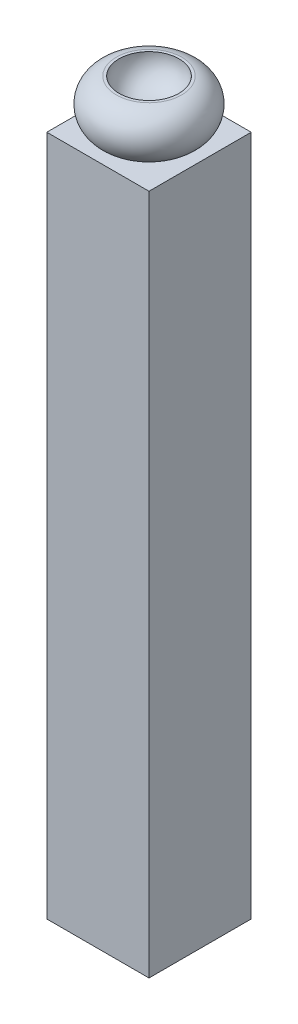
ISO-10303-21;
HEADER;
FILE_DESCRIPTION(('STEP AP214'),'2;1');
FILE_NAME('part.step','',(''),(''),'','','');
FILE_SCHEMA(('AUTOMOTIVE_DESIGN { 1 0 10303 214 1 1 1 1 }'));
ENDSEC;
DATA;
#1=APPLICATION_CONTEXT('core data for automotive mechanical design processes');
#2=APPLICATION_PROTOCOL_DEFINITION('international standard','automotive_design',2000,#1);
#3=PRODUCT_CONTEXT('',#1,'mechanical');
#4=PRODUCT('Part','Part','',(#3));
#5=PRODUCT_RELATED_PRODUCT_CATEGORY('part','',(#4));
#6=PRODUCT_DEFINITION_FORMATION('','',#4);
#7=PRODUCT_DEFINITION_CONTEXT('part definition',#1,'design');
#8=PRODUCT_DEFINITION('design','',#6,#7);
#9=PRODUCT_DEFINITION_SHAPE('','',#8);
#10=(LENGTH_UNIT() NAMED_UNIT(*) SI_UNIT(.MILLI.,.METRE.));
#11=(NAMED_UNIT(*) PLANE_ANGLE_UNIT() SI_UNIT($,.RADIAN.));
#12=(NAMED_UNIT(*) SI_UNIT($,.STERADIAN.) SOLID_ANGLE_UNIT());
#13=UNCERTAINTY_MEASURE_WITH_UNIT(LENGTH_MEASURE(1.E-05),#10,'distance_accuracy_value','');
#14=(GEOMETRIC_REPRESENTATION_CONTEXT(3) GLOBAL_UNCERTAINTY_ASSIGNED_CONTEXT((#13)) GLOBAL_UNIT_ASSIGNED_CONTEXT((#10,
#11,#12)) REPRESENTATION_CONTEXT('',''));
#15=CARTESIAN_POINT('',(0.,0.,0.));
#16=DIRECTION('',(0.,0.,1.));
#17=DIRECTION('',(1.,0.,0.));
#18=AXIS2_PLACEMENT_3D('',#15,#16,#17);
#19=CARTESIAN_POINT('',(0.,8.19273891154382,0.));
#20=DIRECTION('',(0.,-1.,0.));
#21=DIRECTION('',(0.,0.,-1.));
#22=AXIS2_PLACEMENT_3D('',#19,#20,#21);
#23=TOROIDAL_SURFACE('',#22,5.3293309185256,4.572);
#24=CARTESIAN_POINT('',(0.,12.7,0.));
#25=DIRECTION('',(0.,-1.,0.));
#26=DIRECTION('',(0.,0.,-1.));
#27=AXIS2_PLACEMENT_3D('',#24,#25,#26);
#28=CIRCLE('',#27,6.096);
#29=CARTESIAN_POINT('',(0.,12.7,-6.096));
#30=VERTEX_POINT('',#29);
#31=EDGE_CURVE('E125',#30,#30,#28,.T.);
#32=ORIENTED_EDGE('',*,*,#31,.T.);
#33=EDGE_LOOP('',(#32));
#34=FACE_BOUND('',#33,.T.);
#35=CARTESIAN_POINT('',(0.,3.63673505649357,0.));
#36=DIRECTION('',(0.,-1.,0.));
#37=DIRECTION('',(0.,0.,-1.));
#38=AXIS2_PLACEMENT_3D('',#35,#36,#37);
#39=CIRCLE('',#38,5.71144722643093);
#40=CARTESIAN_POINT('',(0.,3.63673505649357,-5.71144722643093));
#41=VERTEX_POINT('',#40);
#42=EDGE_CURVE('E11',#41,#41,#39,.T.);
#43=ORIENTED_EDGE('',*,*,#42,.F.);
#44=EDGE_LOOP('',(#43));
#45=FACE_BOUND('',#44,.T.);
#46=ADVANCED_FACE('F41',(#34,#45),#23,.T.);
#47=CARTESIAN_POINT('',(0.,12.7,0.));
#48=DIRECTION('',(0.,-1.,0.));
#49=DIRECTION('',(0.,0.,-1.));
#50=AXIS2_PLACEMENT_3D('',#47,#48,#49);
#51=PLANE('',#50);
#52=ORIENTED_EDGE('',*,*,#31,.F.);
#53=EDGE_LOOP('',(#52));
#54=FACE_BOUND('',#53,.T.);
#55=CARTESIAN_POINT('',(0.,12.7,0.));
#56=DIRECTION('',(0.,-1.,0.));
#57=DIRECTION('',(0.,0.,-1.));
#58=AXIS2_PLACEMENT_3D('',#55,#56,#57);
#59=CIRCLE('',#58,5.588);
#60=CARTESIAN_POINT('',(0.,12.7,-5.588));
#61=VERTEX_POINT('',#60);
#62=EDGE_CURVE('E47',#61,#61,#59,.T.);
#63=ORIENTED_EDGE('',*,*,#62,.T.);
#64=EDGE_LOOP('',(#63));
#65=FACE_BOUND('',#64,.T.);
#66=ADVANCED_FACE('F43',(#54,#65),#51,.F.);
#67=CARTESIAN_POINT('',(0.,12.4695120661506,-1.14343453397554));
#68=DIRECTION('',(-1.,0.,0.));
#69=DIRECTION('',(0.,0.,-1.));
#70=AXIS2_PLACEMENT_3D('',#67,#68,#69);
#71=CIRCLE('',#70,4.45053781799766);
#72=TRIMMED_CURVE('',#71,(PARAMETER_VALUE(-1.83063074292192)),
(PARAMETER_VALUE(1.83063074292192)),.T.,.PARAMETER.);
#73=CARTESIAN_POINT('',(0.,12.4695120661506,0.));
#74=DIRECTION('',(0.,-1.,0.));
#75=AXIS1_PLACEMENT('',#73,#74);
#76=SURFACE_OF_REVOLUTION('',#72,#75);
#77=CARTESIAN_POINT('',(0.,8.16836752824678,0.));
#78=VERTEX_POINT('',#77);
#79=VERTEX_LOOP('',#78);
#80=FACE_BOUND('',#79,.T.);
#81=ORIENTED_EDGE('',*,*,#62,.F.);
#82=EDGE_LOOP('',(#81));
#83=FACE_BOUND('',#82,.T.);
#84=ADVANCED_FACE('F129',(#80,#83),#76,.F.);
#85=CARTESIAN_POINT('',(0.,3.63673505649357,0.));
#86=DIRECTION('',(0.,-1.,0.));
#87=DIRECTION('',(0.,0.,-1.));
#88=AXIS2_PLACEMENT_3D('',#85,#86,#87);
#89=PLANE('',#88);
#90=DIRECTION('',(0.,0.,1.));
#91=VECTOR('',#90,1.);
#92=CARTESIAN_POINT('',(9.525,3.63673505649357,9.525));
#93=LINE('',#92,#91);
#94=CARTESIAN_POINT('',(9.525,3.63673505649357,-9.525));
#95=VERTEX_POINT('',#94);
#96=CARTESIAN_POINT('',(9.525,3.63673505649357,9.525));
#97=VERTEX_POINT('',#96);
#98=EDGE_CURVE('E115',#95,#97,#93,.T.);
#99=ORIENTED_EDGE('',*,*,#98,.F.);
#100=DIRECTION('',(1.,0.,0.));
#101=VECTOR('',#100,1.);
#102=CARTESIAN_POINT('',(-9.525,3.63673505649357,-9.525));
#103=LINE('',#102,#101);
#104=CARTESIAN_POINT('',(-9.525,3.63673505649357,-9.525));
#105=VERTEX_POINT('',#104);
#106=EDGE_CURVE('E78',#105,#95,#103,.T.);
#107=ORIENTED_EDGE('',*,*,#106,.F.);
#108=DIRECTION('',(0.,0.,-1.));
#109=VECTOR('',#108,1.);
#110=CARTESIAN_POINT('',(-9.525,3.63673505649357,9.525));
#111=LINE('',#110,#109);
#112=CARTESIAN_POINT('',(-9.525,3.63673505649357,9.525));
#113=VERTEX_POINT('',#112);
#114=EDGE_CURVE('E116',#113,#105,#111,.T.);
#115=ORIENTED_EDGE('',*,*,#114,.F.);
#116=DIRECTION('',(-1.,0.,0.));
#117=VECTOR('',#116,1.);
#118=CARTESIAN_POINT('',(-9.525,3.63673505649357,9.525));
#119=LINE('',#118,#117);
#120=EDGE_CURVE('E99',#97,#113,#119,.T.);
#121=ORIENTED_EDGE('',*,*,#120,.F.);
#122=EDGE_LOOP('',(#99,#107,#115,#121));
#123=FACE_BOUND('',#122,.T.);
#124=ORIENTED_EDGE('',*,*,#42,.T.);
#125=EDGE_LOOP('',(#124));
#126=FACE_BOUND('',#125,.T.);
#127=ADVANCED_FACE('F128',(#123,#126),#89,.F.);
#128=CARTESIAN_POINT('',(9.525,-123.363264943506,9.525));
#129=DIRECTION('',(-1.,0.,0.));
#130=DIRECTION('',(0.,0.,1.));
#131=AXIS2_PLACEMENT_3D('',#128,#129,#130);
#132=PLANE('',#131);
#133=ORIENTED_EDGE('',*,*,#98,.T.);
#134=DIRECTION('',(0.,1.,0.));
#135=VECTOR('',#134,1.);
#136=CARTESIAN_POINT('',(9.525,-123.363264943506,9.525));
#137=LINE('',#136,#135);
#138=CARTESIAN_POINT('',(9.525,-123.363264943506,9.525));
#139=VERTEX_POINT('',#138);
#140=EDGE_CURVE('E101',#139,#97,#137,.T.);
#141=ORIENTED_EDGE('',*,*,#140,.F.);
#142=DIRECTION('',(0.,0.,1.));
#143=VECTOR('',#142,1.);
#144=CARTESIAN_POINT('',(9.525,-123.363264943506,9.525));
#145=LINE('',#144,#143);
#146=CARTESIAN_POINT('',(9.525,-123.363264943506,-9.525));
#147=VERTEX_POINT('',#146);
#148=EDGE_CURVE('E91',#147,#139,#145,.T.);
#149=ORIENTED_EDGE('',*,*,#148,.F.);
#150=DIRECTION('',(0.,1.,0.));
#151=VECTOR('',#150,1.);
#152=CARTESIAN_POINT('',(9.525,-123.363264943506,-9.525));
#153=LINE('',#152,#151);
#154=EDGE_CURVE('E108',#147,#95,#153,.T.);
#155=ORIENTED_EDGE('',*,*,#154,.T.);
#156=EDGE_LOOP('',(#133,#141,#149,#155));
#157=FACE_BOUND('',#156,.T.);
#158=ADVANCED_FACE('F137',(#157),#132,.F.);
#159=CARTESIAN_POINT('',(-9.525,-123.363264943506,9.525));
#160=DIRECTION('',(0.,0.,-1.));
#161=DIRECTION('',(-1.,0.,0.));
#162=AXIS2_PLACEMENT_3D('',#159,#160,#161);
#163=PLANE('',#162);
#164=ORIENTED_EDGE('',*,*,#120,.T.);
#165=DIRECTION('',(0.,1.,0.));
#166=VECTOR('',#165,1.);
#167=CARTESIAN_POINT('',(-9.525,-123.363264943506,9.525));
#168=LINE('',#167,#166);
#169=CARTESIAN_POINT('',(-9.525,-123.363264943506,9.525));
#170=VERTEX_POINT('',#169);
#171=EDGE_CURVE('E96',#170,#113,#168,.T.);
#172=ORIENTED_EDGE('',*,*,#171,.F.);
#173=DIRECTION('',(-1.,0.,0.));
#174=VECTOR('',#173,1.);
#175=CARTESIAN_POINT('',(-9.525,-123.363264943506,9.525));
#176=LINE('',#175,#174);
#177=EDGE_CURVE('E88',#139,#170,#176,.T.);
#178=ORIENTED_EDGE('',*,*,#177,.F.);
#179=ORIENTED_EDGE('',*,*,#140,.T.);
#180=EDGE_LOOP('',(#164,#172,#178,#179));
#181=FACE_BOUND('',#180,.T.);
#182=ADVANCED_FACE('F100',(#181),#163,.F.);
#183=CARTESIAN_POINT('',(-9.525,-123.363264943506,9.525));
#184=DIRECTION('',(1.,0.,0.));
#185=DIRECTION('',(0.,0.,-1.));
#186=AXIS2_PLACEMENT_3D('',#183,#184,#185);
#187=PLANE('',#186);
#188=ORIENTED_EDGE('',*,*,#114,.T.);
#189=DIRECTION('',(0.,1.,0.));
#190=VECTOR('',#189,1.);
#191=CARTESIAN_POINT('',(-9.525,-123.363264943506,-9.525));
#192=LINE('',#191,#190);
#193=CARTESIAN_POINT('',(-9.525,-123.363264943506,-9.525));
#194=VERTEX_POINT('',#193);
#195=EDGE_CURVE('E104',#194,#105,#192,.T.);
#196=ORIENTED_EDGE('',*,*,#195,.F.);
#197=DIRECTION('',(0.,0.,-1.));
#198=VECTOR('',#197,1.);
#199=CARTESIAN_POINT('',(-9.525,-123.363264943506,9.525));
#200=LINE('',#199,#198);
#201=EDGE_CURVE('E92',#170,#194,#200,.T.);
#202=ORIENTED_EDGE('',*,*,#201,.F.);
#203=ORIENTED_EDGE('',*,*,#171,.T.);
#204=EDGE_LOOP('',(#188,#196,#202,#203));
#205=FACE_BOUND('',#204,.T.);
#206=ADVANCED_FACE('F106',(#205),#187,.F.);
#207=CARTESIAN_POINT('',(-9.525,-123.363264943506,-9.525));
#208=DIRECTION('',(0.,0.,1.));
#209=DIRECTION('',(1.,0.,0.));
#210=AXIS2_PLACEMENT_3D('',#207,#208,#209);
#211=PLANE('',#210);
#212=ORIENTED_EDGE('',*,*,#106,.T.);
#213=ORIENTED_EDGE('',*,*,#154,.F.);
#214=DIRECTION('',(1.,0.,0.));
#215=VECTOR('',#214,1.);
#216=CARTESIAN_POINT('',(-9.525,-123.363264943506,-9.525));
#217=LINE('',#216,#215);
#218=EDGE_CURVE('E58',#194,#147,#217,.T.);
#219=ORIENTED_EDGE('',*,*,#218,.F.);
#220=ORIENTED_EDGE('',*,*,#195,.T.);
#221=EDGE_LOOP('',(#212,#213,#219,#220));
#222=FACE_BOUND('',#221,.T.);
#223=ADVANCED_FACE('F153',(#222),#211,.F.);
#224=CARTESIAN_POINT('',(0.,-123.363264943506,0.));
#225=DIRECTION('',(0.,-1.,0.));
#226=DIRECTION('',(0.,0.,-1.));
#227=AXIS2_PLACEMENT_3D('',#224,#225,#226);
#228=PLANE('',#227);
#229=ORIENTED_EDGE('',*,*,#148,.T.);
#230=ORIENTED_EDGE('',*,*,#177,.T.);
#231=ORIENTED_EDGE('',*,*,#201,.T.);
#232=ORIENTED_EDGE('',*,*,#218,.T.);
#233=EDGE_LOOP('',(#229,#230,#231,#232));
#234=FACE_BOUND('',#233,.T.);
#235=ADVANCED_FACE('F87',(#234),#228,.T.);
#236=CLOSED_SHELL('',(#46,#66,#84,#127,#158,#182,#206,#223,#235));
#237=MANIFOLD_SOLID_BREP('B2',#236);
#238=ADVANCED_BREP_SHAPE_REPRESENTATION('',(#18,#237),#14);
#239=SHAPE_DEFINITION_REPRESENTATION(#9,#238);
ENDSEC;
END-ISO-10303-21;
